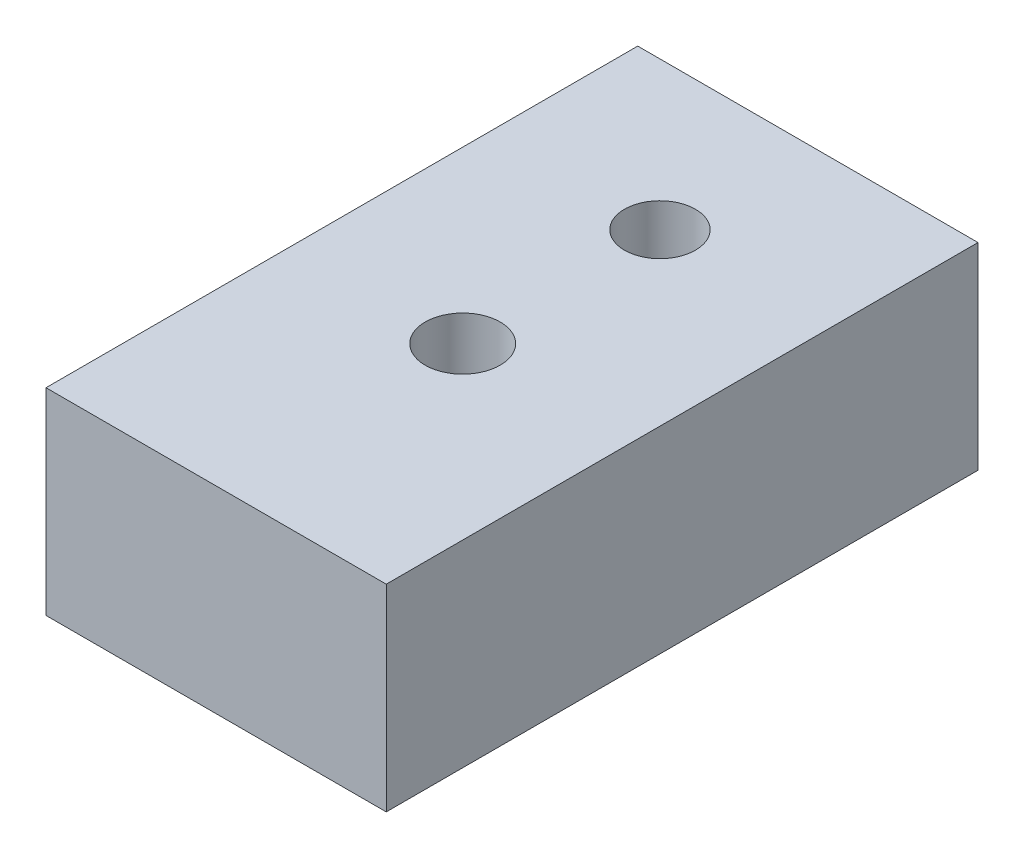
ISO-10303-21;
HEADER;
FILE_DESCRIPTION(('STEP AP214'),'2;1');
FILE_NAME('part.step','',(''),(''),'','','');
FILE_SCHEMA(('AUTOMOTIVE_DESIGN { 1 0 10303 214 1 1 1 1 }'));
ENDSEC;
DATA;
#1=APPLICATION_CONTEXT('core data for automotive mechanical design processes');
#2=APPLICATION_PROTOCOL_DEFINITION('international standard','automotive_design',2000,#1);
#3=PRODUCT_CONTEXT('',#1,'mechanical');
#4=PRODUCT('Part','Part','',(#3));
#5=PRODUCT_RELATED_PRODUCT_CATEGORY('part','',(#4));
#6=PRODUCT_DEFINITION_FORMATION('','',#4);
#7=PRODUCT_DEFINITION_CONTEXT('part definition',#1,'design');
#8=PRODUCT_DEFINITION('design','',#6,#7);
#9=PRODUCT_DEFINITION_SHAPE('','',#8);
#10=(LENGTH_UNIT() NAMED_UNIT(*) SI_UNIT(.MILLI.,.METRE.));
#11=(NAMED_UNIT(*) PLANE_ANGLE_UNIT() SI_UNIT($,.RADIAN.));
#12=(NAMED_UNIT(*) SI_UNIT($,.STERADIAN.) SOLID_ANGLE_UNIT());
#13=UNCERTAINTY_MEASURE_WITH_UNIT(LENGTH_MEASURE(1.E-05),#10,'distance_accuracy_value','');
#14=(GEOMETRIC_REPRESENTATION_CONTEXT(3) GLOBAL_UNCERTAINTY_ASSIGNED_CONTEXT((#13)) GLOBAL_UNIT_ASSIGNED_CONTEXT((#10,
#11,#12)) REPRESENTATION_CONTEXT('',''));
#15=CARTESIAN_POINT('',(0.,0.,0.));
#16=DIRECTION('',(0.,0.,1.));
#17=DIRECTION('',(1.,0.,0.));
#18=AXIS2_PLACEMENT_3D('',#15,#16,#17);
#19=CARTESIAN_POINT('',(10.95375,12.7,-19.05));
#20=DIRECTION('',(-1.,0.,0.));
#21=DIRECTION('',(0.,0.,1.));
#22=AXIS2_PLACEMENT_3D('',#19,#20,#21);
#23=PLANE('',#22);
#24=DIRECTION('',(0.,0.,-1.));
#25=VECTOR('',#24,1.);
#26=CARTESIAN_POINT('',(10.95375,0.,-19.05));
#27=LINE('',#26,#25);
#28=CARTESIAN_POINT('',(10.95375,0.,19.05));
#29=VERTEX_POINT('',#28);
#30=CARTESIAN_POINT('',(10.95375,0.,-19.05));
#31=VERTEX_POINT('',#30);
#32=EDGE_CURVE('E113',#29,#31,#27,.T.);
#33=ORIENTED_EDGE('',*,*,#32,.T.);
#34=DIRECTION('',(0.,-1.,0.));
#35=VECTOR('',#34,1.);
#36=CARTESIAN_POINT('',(10.95375,12.7,-19.05));
#37=LINE('',#36,#35);
#38=CARTESIAN_POINT('',(10.95375,12.7,-19.05));
#39=VERTEX_POINT('',#38);
#40=EDGE_CURVE('E11',#39,#31,#37,.T.);
#41=ORIENTED_EDGE('',*,*,#40,.F.);
#42=DIRECTION('',(0.,0.,-1.));
#43=VECTOR('',#42,1.);
#44=CARTESIAN_POINT('',(10.95375,12.7,-19.05));
#45=LINE('',#44,#43);
#46=CARTESIAN_POINT('',(10.95375,12.7,19.05));
#47=VERTEX_POINT('',#46);
#48=EDGE_CURVE('E97',#47,#39,#45,.T.);
#49=ORIENTED_EDGE('',*,*,#48,.F.);
#50=DIRECTION('',(0.,-1.,0.));
#51=VECTOR('',#50,1.);
#52=CARTESIAN_POINT('',(10.95375,12.7,19.05));
#53=LINE('',#52,#51);
#54=EDGE_CURVE('E109',#47,#29,#53,.T.);
#55=ORIENTED_EDGE('',*,*,#54,.T.);
#56=EDGE_LOOP('',(#33,#41,#49,#55));
#57=FACE_BOUND('',#56,.T.);
#58=ADVANCED_FACE('F45',(#57),#23,.F.);
#59=CARTESIAN_POINT('',(-10.95375,12.7,-19.05));
#60=DIRECTION('',(0.,0.,1.));
#61=DIRECTION('',(1.,0.,0.));
#62=AXIS2_PLACEMENT_3D('',#59,#60,#61);
#63=PLANE('',#62);
#64=DIRECTION('',(-1.,0.,0.));
#65=VECTOR('',#64,1.);
#66=CARTESIAN_POINT('',(-10.95375,0.,-19.05));
#67=LINE('',#66,#65);
#68=CARTESIAN_POINT('',(-10.95375,0.,-19.05));
#69=VERTEX_POINT('',#68);
#70=EDGE_CURVE('E102',#31,#69,#67,.T.);
#71=ORIENTED_EDGE('',*,*,#70,.T.);
#72=DIRECTION('',(0.,-1.,0.));
#73=VECTOR('',#72,1.);
#74=CARTESIAN_POINT('',(-10.95375,12.7,-19.05));
#75=LINE('',#74,#73);
#76=CARTESIAN_POINT('',(-10.95375,12.7,-19.05));
#77=VERTEX_POINT('',#76);
#78=EDGE_CURVE('E54',#77,#69,#75,.T.);
#79=ORIENTED_EDGE('',*,*,#78,.F.);
#80=DIRECTION('',(-1.,0.,0.));
#81=VECTOR('',#80,1.);
#82=CARTESIAN_POINT('',(-10.95375,12.7,-19.05));
#83=LINE('',#82,#81);
#84=EDGE_CURVE('E92',#39,#77,#83,.T.);
#85=ORIENTED_EDGE('',*,*,#84,.F.);
#86=ORIENTED_EDGE('',*,*,#40,.T.);
#87=EDGE_LOOP('',(#71,#79,#85,#86));
#88=FACE_BOUND('',#87,.T.);
#89=ADVANCED_FACE('F101',(#88),#63,.F.);
#90=CARTESIAN_POINT('',(-10.95375,12.7,-19.05));
#91=DIRECTION('',(1.,0.,0.));
#92=DIRECTION('',(0.,0.,-1.));
#93=AXIS2_PLACEMENT_3D('',#90,#91,#92);
#94=PLANE('',#93);
#95=DIRECTION('',(0.,0.,1.));
#96=VECTOR('',#95,1.);
#97=CARTESIAN_POINT('',(-10.95375,0.,-19.05));
#98=LINE('',#97,#96);
#99=CARTESIAN_POINT('',(-10.95375,0.,19.05));
#100=VERTEX_POINT('',#99);
#101=EDGE_CURVE('E79',#69,#100,#98,.T.);
#102=ORIENTED_EDGE('',*,*,#101,.T.);
#103=DIRECTION('',(0.,-1.,0.));
#104=VECTOR('',#103,1.);
#105=CARTESIAN_POINT('',(-10.95375,12.7,19.05));
#106=LINE('',#105,#104);
#107=CARTESIAN_POINT('',(-10.95375,12.7,19.05));
#108=VERTEX_POINT('',#107);
#109=EDGE_CURVE('E104',#108,#100,#106,.T.);
#110=ORIENTED_EDGE('',*,*,#109,.F.);
#111=DIRECTION('',(0.,0.,1.));
#112=VECTOR('',#111,1.);
#113=CARTESIAN_POINT('',(-10.95375,12.7,-19.05));
#114=LINE('',#113,#112);
#115=EDGE_CURVE('E95',#77,#108,#114,.T.);
#116=ORIENTED_EDGE('',*,*,#115,.F.);
#117=ORIENTED_EDGE('',*,*,#78,.T.);
#118=EDGE_LOOP('',(#102,#110,#116,#117));
#119=FACE_BOUND('',#118,.T.);
#120=ADVANCED_FACE('F105',(#119),#94,.F.);
#121=CARTESIAN_POINT('',(-10.95375,12.7,19.05));
#122=DIRECTION('',(0.,0.,-1.));
#123=DIRECTION('',(-1.,0.,0.));
#124=AXIS2_PLACEMENT_3D('',#121,#122,#123);
#125=PLANE('',#124);
#126=DIRECTION('',(1.,0.,0.));
#127=VECTOR('',#126,1.);
#128=CARTESIAN_POINT('',(-10.95375,0.,19.05));
#129=LINE('',#128,#127);
#130=EDGE_CURVE('E85',#100,#29,#129,.T.);
#131=ORIENTED_EDGE('',*,*,#130,.T.);
#132=ORIENTED_EDGE('',*,*,#54,.F.);
#133=DIRECTION('',(1.,0.,0.));
#134=VECTOR('',#133,1.);
#135=CARTESIAN_POINT('',(-10.95375,12.7,19.05));
#136=LINE('',#135,#134);
#137=EDGE_CURVE('E62',#108,#47,#136,.T.);
#138=ORIENTED_EDGE('',*,*,#137,.F.);
#139=ORIENTED_EDGE('',*,*,#109,.T.);
#140=EDGE_LOOP('',(#131,#132,#138,#139));
#141=FACE_BOUND('',#140,.T.);
#142=ADVANCED_FACE('F127',(#141),#125,.F.);
#143=CARTESIAN_POINT('',(0.,12.7,0.));
#144=DIRECTION('',(0.,1.,0.));
#145=DIRECTION('',(0.,0.,1.));
#146=AXIS2_PLACEMENT_3D('',#143,#144,#145);
#147=PLANE('',#146);
#148=CARTESIAN_POINT('',(0.,12.7,-9.52499999999999));
#149=DIRECTION('',(0.,1.,0.));
#150=DIRECTION('',(0.,0.,1.));
#151=AXIS2_PLACEMENT_3D('',#148,#149,#150);
#152=CIRCLE('',#151,2.286);
#153=CARTESIAN_POINT('',(0.,12.7,-7.23899999999999));
#154=VERTEX_POINT('',#153);
#155=EDGE_CURVE('E142',#154,#154,#152,.T.);
#156=ORIENTED_EDGE('',*,*,#155,.F.);
#157=EDGE_LOOP('',(#156));
#158=FACE_BOUND('',#157,.T.);
#159=CARTESIAN_POINT('',(0.,12.7,3.17500000000001));
#160=DIRECTION('',(0.,1.,0.));
#161=DIRECTION('',(0.,0.,1.));
#162=AXIS2_PLACEMENT_3D('',#159,#160,#161);
#163=CIRCLE('',#162,2.413);
#164=CARTESIAN_POINT('',(0.,12.7,5.58800000000001));
#165=VERTEX_POINT('',#164);
#166=EDGE_CURVE('E138',#165,#165,#163,.T.);
#167=ORIENTED_EDGE('',*,*,#166,.F.);
#168=EDGE_LOOP('',(#167));
#169=FACE_BOUND('',#168,.T.);
#170=ORIENTED_EDGE('',*,*,#48,.T.);
#171=ORIENTED_EDGE('',*,*,#84,.T.);
#172=ORIENTED_EDGE('',*,*,#115,.T.);
#173=ORIENTED_EDGE('',*,*,#137,.T.);
#174=EDGE_LOOP('',(#170,#171,#172,#173));
#175=FACE_BOUND('',#174,.T.);
#176=ADVANCED_FACE('F93',(#158,#169,#175),#147,.T.);
#177=CARTESIAN_POINT('',(0.,0.,0.));
#178=DIRECTION('',(0.,1.,0.));
#179=DIRECTION('',(0.,0.,1.));
#180=AXIS2_PLACEMENT_3D('',#177,#178,#179);
#181=PLANE('',#180);
#182=CARTESIAN_POINT('',(0.,0.,-9.52499999999999));
#183=DIRECTION('',(0.,1.,0.));
#184=DIRECTION('',(0.,0.,1.));
#185=AXIS2_PLACEMENT_3D('',#182,#183,#184);
#186=CIRCLE('',#185,2.286);
#187=CARTESIAN_POINT('',(0.,0.,-7.23899999999999));
#188=VERTEX_POINT('',#187);
#189=EDGE_CURVE('E117',#188,#188,#186,.T.);
#190=ORIENTED_EDGE('',*,*,#189,.T.);
#191=EDGE_LOOP('',(#190));
#192=FACE_BOUND('',#191,.T.);
#193=CARTESIAN_POINT('',(0.,0.,3.17500000000001));
#194=DIRECTION('',(0.,1.,0.));
#195=DIRECTION('',(0.,0.,1.));
#196=AXIS2_PLACEMENT_3D('',#193,#194,#195);
#197=CIRCLE('',#196,2.413);
#198=CARTESIAN_POINT('',(0.,0.,5.58800000000001));
#199=VERTEX_POINT('',#198);
#200=EDGE_CURVE('E134',#199,#199,#197,.T.);
#201=ORIENTED_EDGE('',*,*,#200,.T.);
#202=EDGE_LOOP('',(#201));
#203=FACE_BOUND('',#202,.T.);
#204=ORIENTED_EDGE('',*,*,#32,.F.);
#205=ORIENTED_EDGE('',*,*,#130,.F.);
#206=ORIENTED_EDGE('',*,*,#101,.F.);
#207=ORIENTED_EDGE('',*,*,#70,.F.);
#208=EDGE_LOOP('',(#204,#205,#206,#207));
#209=FACE_BOUND('',#208,.T.);
#210=ADVANCED_FACE('F130',(#192,#203,#209),#181,.F.);
#211=CARTESIAN_POINT('',(0.,0.,3.17500000000001));
#212=DIRECTION('',(0.,1.,0.));
#213=DIRECTION('',(0.,0.,1.));
#214=AXIS2_PLACEMENT_3D('',#211,#212,#213);
#215=CYLINDRICAL_SURFACE('',#214,2.413);
#216=ORIENTED_EDGE('',*,*,#200,.F.);
#217=EDGE_LOOP('',(#216));
#218=FACE_BOUND('',#217,.T.);
#219=ORIENTED_EDGE('',*,*,#166,.T.);
#220=EDGE_LOOP('',(#219));
#221=FACE_BOUND('',#220,.T.);
#222=ADVANCED_FACE('F155',(#218,#221),#215,.F.);
#223=CARTESIAN_POINT('',(0.,0.,-9.52499999999999));
#224=DIRECTION('',(0.,1.,0.));
#225=DIRECTION('',(0.,0.,1.));
#226=AXIS2_PLACEMENT_3D('',#223,#224,#225);
#227=CYLINDRICAL_SURFACE('',#226,2.286);
#228=ORIENTED_EDGE('',*,*,#189,.F.);
#229=EDGE_LOOP('',(#228));
#230=FACE_BOUND('',#229,.T.);
#231=ORIENTED_EDGE('',*,*,#155,.T.);
#232=EDGE_LOOP('',(#231));
#233=FACE_BOUND('',#232,.T.);
#234=ADVANCED_FACE('F152',(#230,#233),#227,.F.);
#235=CLOSED_SHELL('',(#58,#89,#120,#142,#176,#210,#222,#234));
#236=MANIFOLD_SOLID_BREP('B2',#235);
#237=ADVANCED_BREP_SHAPE_REPRESENTATION('',(#18,#236),#14);
#238=SHAPE_DEFINITION_REPRESENTATION(#9,#237);
ENDSEC;
END-ISO-10303-21;
